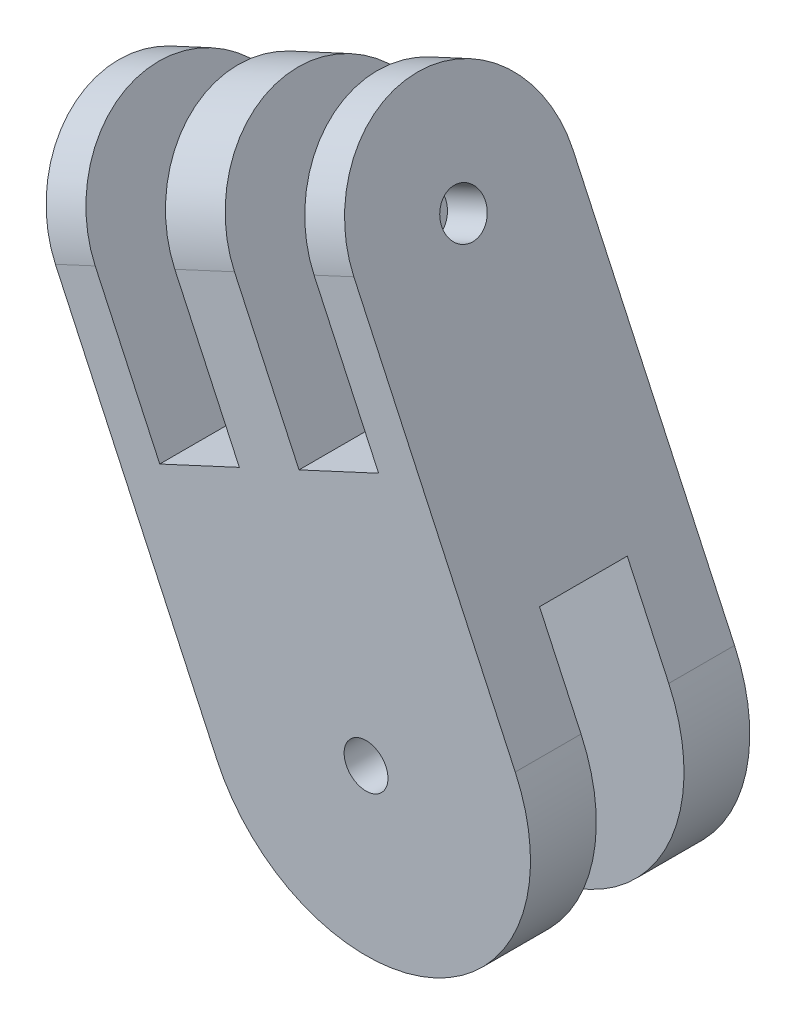
ISO-10303-21;
HEADER;
FILE_DESCRIPTION(('STEP AP214'),'2;1');
FILE_NAME('part.step','',(''),(''),'','','');
FILE_SCHEMA(('AUTOMOTIVE_DESIGN { 1 0 10303 214 1 1 1 1 }'));
ENDSEC;
DATA;
#1=APPLICATION_CONTEXT('core data for automotive mechanical design processes');
#2=APPLICATION_PROTOCOL_DEFINITION('international standard','automotive_design',2000,#1);
#3=PRODUCT_CONTEXT('',#1,'mechanical');
#4=PRODUCT('Part','Part','',(#3));
#5=PRODUCT_RELATED_PRODUCT_CATEGORY('part','',(#4));
#6=PRODUCT_DEFINITION_FORMATION('','',#4);
#7=PRODUCT_DEFINITION_CONTEXT('part definition',#1,'design');
#8=PRODUCT_DEFINITION('design','',#6,#7);
#9=PRODUCT_DEFINITION_SHAPE('','',#8);
#10=(LENGTH_UNIT() NAMED_UNIT(*) SI_UNIT(.MILLI.,.METRE.));
#11=(NAMED_UNIT(*) PLANE_ANGLE_UNIT() SI_UNIT($,.RADIAN.));
#12=(NAMED_UNIT(*) SI_UNIT($,.STERADIAN.) SOLID_ANGLE_UNIT());
#13=UNCERTAINTY_MEASURE_WITH_UNIT(LENGTH_MEASURE(1.E-05),#10,'distance_accuracy_value','');
#14=(GEOMETRIC_REPRESENTATION_CONTEXT(3) GLOBAL_UNCERTAINTY_ASSIGNED_CONTEXT((#13)) GLOBAL_UNIT_ASSIGNED_CONTEXT((#10,
#11,#12)) REPRESENTATION_CONTEXT('',''));
#15=CARTESIAN_POINT('',(0.,0.,0.));
#16=DIRECTION('',(0.,0.,1.));
#17=DIRECTION('',(1.,0.,0.));
#18=AXIS2_PLACEMENT_3D('',#15,#16,#17);
#19=CARTESIAN_POINT('',(-41.5292782261181,-19.251151013862,10.));
#20=DIRECTION('',(0.907261631256999,0.420566680145836,0.));
#21=DIRECTION('',(-0.420566680145836,0.907261631256999,0.));
#22=AXIS2_PLACEMENT_3D('',#19,#20,#21);
#23=PLANE('',#22);
#24=CARTESIAN_POINT('',(-85.2157958373442,74.9909825240462,5.));
#25=DIRECTION('',(-0.907261631256999,-0.420566680145836,0.));
#26=DIRECTION('',(0.420566680145836,-0.907261631256999,0.));
#27=AXIS2_PLACEMENT_3D('',#24,#25,#26);
#28=CIRCLE('',#27,0.999999999999999);
#29=CARTESIAN_POINT('',(-84.7952291571984,74.0837208927892,5.));
#30=VERTEX_POINT('',#29);
#31=EDGE_CURVE('E353',#30,#30,#28,.T.);
#32=ORIENTED_EDGE('',*,*,#31,.F.);
#33=EDGE_LOOP('',(#32));
#34=FACE_BOUND('',#33,.T.);
#35=DIRECTION('',(0.420566680145836,-0.907261631256999,0.));
#36=VECTOR('',#35,1.);
#37=CARTESIAN_POINT('',(-41.5292782261181,-19.251151013862,10.));
#38=LINE('',#37,#36);
#39=CARTESIAN_POINT('',(-85.2157958373442,74.9909825240462,10.));
#40=VERTEX_POINT('',#39);
#41=CARTESIAN_POINT('',(-77.8558789347921,59.1139039770487,10.));
#42=VERTEX_POINT('',#41);
#43=EDGE_CURVE('E225',#40,#42,#38,.T.);
#44=ORIENTED_EDGE('',*,*,#43,.F.);
#45=CARTESIAN_POINT('',(-85.2157958373442,74.9909825240462,5.));
#46=DIRECTION('',(-0.907261631256999,-0.420566680145836,0.));
#47=DIRECTION('',(0.420566680145836,-0.907261631256999,0.));
#48=AXIS2_PLACEMENT_3D('',#45,#46,#47);
#49=CIRCLE('',#48,5.);
#50=CARTESIAN_POINT('',(-85.2157958373442,74.9909825240462,0.));
#51=VERTEX_POINT('',#50);
#52=EDGE_CURVE('E204',#51,#40,#49,.F.);
#53=ORIENTED_EDGE('',*,*,#52,.F.);
#54=DIRECTION('',(0.420566680145836,-0.907261631256999,0.));
#55=VECTOR('',#54,1.);
#56=CARTESIAN_POINT('',(-41.5292782261181,-19.251151013862,0.));
#57=LINE('',#56,#55);
#58=CARTESIAN_POINT('',(-77.8558789347921,59.1139039770487,0.));
#59=VERTEX_POINT('',#58);
#60=EDGE_CURVE('E244',#51,#59,#57,.T.);
#61=ORIENTED_EDGE('',*,*,#60,.T.);
#62=DIRECTION('',(0.,0.,-1.));
#63=VECTOR('',#62,1.);
#64=CARTESIAN_POINT('',(-77.8558789347921,59.1139039770487,10.));
#65=LINE('',#64,#63);
#66=CARTESIAN_POINT('',(-77.8558789347921,59.1139039770487,3.));
#67=VERTEX_POINT('',#66);
#68=EDGE_CURVE('E280',#67,#59,#65,.T.);
#69=ORIENTED_EDGE('',*,*,#68,.F.);
#70=DIRECTION('',(-0.420566680145836,0.907261631256999,0.));
#71=VECTOR('',#70,1.);
#72=CARTESIAN_POINT('',(-41.5292782261182,-19.251151013862,3.));
#73=LINE('',#72,#71);
#74=CARTESIAN_POINT('',(-79.7484289954484,63.1965813177052,3.));
#75=VERTEX_POINT('',#74);
#76=EDGE_CURVE('E341',#67,#75,#73,.T.);
#77=ORIENTED_EDGE('',*,*,#76,.T.);
#78=DIRECTION('',(0.,0.,1.));
#79=VECTOR('',#78,1.);
#80=CARTESIAN_POINT('',(-79.7484289954484,63.1965813177052,0.));
#81=LINE('',#80,#79);
#82=CARTESIAN_POINT('',(-79.7484289954484,63.1965813177052,7.));
#83=VERTEX_POINT('',#82);
#84=EDGE_CURVE('E346',#75,#83,#81,.T.);
#85=ORIENTED_EDGE('',*,*,#84,.T.);
#86=DIRECTION('',(0.420566680145836,-0.907261631256999,0.));
#87=VECTOR('',#86,1.);
#88=CARTESIAN_POINT('',(-41.5292782261182,-19.251151013862,7.00000000000001));
#89=LINE('',#88,#87);
#90=CARTESIAN_POINT('',(-77.8558789347921,59.1139039770487,7.));
#91=VERTEX_POINT('',#90);
#92=EDGE_CURVE('E330',#83,#91,#89,.T.);
#93=ORIENTED_EDGE('',*,*,#92,.T.);
#94=EDGE_CURVE('E281',#42,#91,#65,.T.);
#95=ORIENTED_EDGE('',*,*,#94,.F.);
#96=EDGE_LOOP('',(#44,#53,#61,#69,#77,#85,#93,#95));
#97=FACE_BOUND('',#96,.T.);
#98=ADVANCED_FACE('F81',(#34,#97),#23,.F.);
#99=CARTESIAN_POINT('',(-27.9203537572631,-12.9426508116744,10.));
#100=DIRECTION('',(-0.907261631256998,-0.420566680145836,0.));
#101=DIRECTION('',(0.420566680145836,-0.907261631256999,0.));
#102=AXIS2_PLACEMENT_3D('',#99,#100,#101);
#103=PLANE('',#102);
#104=CARTESIAN_POINT('',(-71.6068713684893,81.2994827262337,5.));
#105=DIRECTION('',(-0.907261631256999,-0.420566680145836,0.));
#106=DIRECTION('',(0.420566680145836,-0.907261631256999,0.));
#107=AXIS2_PLACEMENT_3D('',#104,#105,#106);
#108=CIRCLE('',#107,0.999999999999999);
#109=CARTESIAN_POINT('',(-71.1863046883434,80.3922210949767,5.));
#110=VERTEX_POINT('',#109);
#111=EDGE_CURVE('E214',#110,#110,#108,.T.);
#112=ORIENTED_EDGE('',*,*,#111,.T.);
#113=EDGE_LOOP('',(#112));
#114=FACE_BOUND('',#113,.T.);
#115=CARTESIAN_POINT('',(-71.6068713684893,81.2994827262337,5.));
#116=DIRECTION('',(-0.907261631256999,-0.420566680145836,0.));
#117=DIRECTION('',(0.420566680145836,-0.907261631256999,0.));
#118=AXIS2_PLACEMENT_3D('',#115,#116,#117);
#119=CIRCLE('',#118,5.);
#120=CARTESIAN_POINT('',(-71.6068713684893,81.2994827262338,0.));
#121=VERTEX_POINT('',#120);
#122=CARTESIAN_POINT('',(-71.6068713684893,81.2994827262337,10.));
#123=VERTEX_POINT('',#122);
#124=EDGE_CURVE('E98',#121,#123,#119,.F.);
#125=ORIENTED_EDGE('',*,*,#124,.T.);
#126=DIRECTION('',(-0.420566680145836,0.907261631256999,0.));
#127=VECTOR('',#126,1.);
#128=CARTESIAN_POINT('',(-27.9203537572631,-12.9426508116744,10.));
#129=LINE('',#128,#127);
#130=CARTESIAN_POINT('',(-64.2469544659371,65.4224041792363,10.));
#131=VERTEX_POINT('',#130);
#132=EDGE_CURVE('E199',#131,#123,#129,.T.);
#133=ORIENTED_EDGE('',*,*,#132,.F.);
#134=DIRECTION('',(0.,0.,-1.));
#135=VECTOR('',#134,1.);
#136=CARTESIAN_POINT('',(-64.2469544659371,65.4224041792363,10.));
#137=LINE('',#136,#135);
#138=CARTESIAN_POINT('',(-64.2469544659372,65.4224041792363,7.));
#139=VERTEX_POINT('',#138);
#140=EDGE_CURVE('E278',#131,#139,#137,.T.);
#141=ORIENTED_EDGE('',*,*,#140,.T.);
#142=DIRECTION('',(0.420566680145836,-0.907261631256999,0.));
#143=VECTOR('',#142,1.);
#144=CARTESIAN_POINT('',(-27.9203537572632,-12.9426508116745,7.00000000000001));
#145=LINE('',#144,#143);
#146=CARTESIAN_POINT('',(-66.1395045265934,69.5050815198928,7.));
#147=VERTEX_POINT('',#146);
#148=EDGE_CURVE('E336',#147,#139,#145,.T.);
#149=ORIENTED_EDGE('',*,*,#148,.F.);
#150=DIRECTION('',(0.,0.,1.));
#151=VECTOR('',#150,1.);
#152=CARTESIAN_POINT('',(-66.1395045265934,69.5050815198928,0.));
#153=LINE('',#152,#151);
#154=CARTESIAN_POINT('',(-66.1395045265934,69.5050815198928,3.));
#155=VERTEX_POINT('',#154);
#156=EDGE_CURVE('E338',#155,#147,#153,.T.);
#157=ORIENTED_EDGE('',*,*,#156,.F.);
#158=DIRECTION('',(-0.420566680145836,0.907261631256999,0.));
#159=VECTOR('',#158,1.);
#160=CARTESIAN_POINT('',(-27.9203537572632,-12.9426508116745,3.));
#161=LINE('',#160,#159);
#162=CARTESIAN_POINT('',(-64.2469544659372,65.4224041792363,3.));
#163=VERTEX_POINT('',#162);
#164=EDGE_CURVE('E343',#163,#155,#161,.T.);
#165=ORIENTED_EDGE('',*,*,#164,.F.);
#166=CARTESIAN_POINT('',(-64.2469544659371,65.4224041792363,0.));
#167=VERTEX_POINT('',#166);
#168=EDGE_CURVE('E277',#163,#167,#137,.T.);
#169=ORIENTED_EDGE('',*,*,#168,.T.);
#170=DIRECTION('',(-0.420566680145836,0.907261631256999,0.));
#171=VECTOR('',#170,1.);
#172=CARTESIAN_POINT('',(-27.9203537572631,-12.9426508116744,0.));
#173=LINE('',#172,#171);
#174=EDGE_CURVE('E202',#167,#121,#173,.T.);
#175=ORIENTED_EDGE('',*,*,#174,.T.);
#176=EDGE_LOOP('',(#125,#133,#141,#149,#157,#165,#169,#175));
#177=FACE_BOUND('',#176,.T.);
#178=ADVANCED_FACE('F196',(#114,#177),#103,.F.);
#179=CARTESIAN_POINT('',(-29.7348770197771,-13.7837841719661,10.));
#180=DIRECTION('',(0.907261631256999,0.420566680145836,0.));
#181=DIRECTION('',(-0.420566680145836,0.907261631256999,0.));
#182=AXIS2_PLACEMENT_3D('',#179,#180,#181);
#183=PLANE('',#182);
#184=DIRECTION('',(0.420566680145836,-0.907261631256999,0.));
#185=VECTOR('',#184,1.);
#186=CARTESIAN_POINT('',(-29.7348770197771,-13.7837841719661,10.));
#187=LINE('',#186,#185);
#188=CARTESIAN_POINT('',(-73.4213946310032,80.4583493659421,10.));
#189=VERTEX_POINT('',#188);
#190=CARTESIAN_POINT('',(-70.4774278699824,74.1075179471431,10.));
#191=VERTEX_POINT('',#190);
#192=EDGE_CURVE('E221',#189,#191,#187,.T.);
#193=ORIENTED_EDGE('',*,*,#192,.F.);
#194=CARTESIAN_POINT('',(-73.4213946310032,80.4583493659421,5.));
#195=DIRECTION('',(0.907261631256999,0.420566680145836,0.));
#196=DIRECTION('',(-0.420566680145836,0.907261631256999,0.));
#197=AXIS2_PLACEMENT_3D('',#194,#195,#196);
#198=CIRCLE('',#197,5.);
#199=CARTESIAN_POINT('',(-73.4213946310032,80.4583493659421,0.));
#200=VERTEX_POINT('',#199);
#201=EDGE_CURVE('E210',#189,#200,#198,.F.);
#202=ORIENTED_EDGE('',*,*,#201,.T.);
#203=DIRECTION('',(0.420566680145836,-0.907261631256999,0.));
#204=VECTOR('',#203,1.);
#205=CARTESIAN_POINT('',(-29.7348770197771,-13.7837841719661,0.));
#206=LINE('',#205,#204);
#207=CARTESIAN_POINT('',(-70.4774278699824,74.1075179471431,0.));
#208=VERTEX_POINT('',#207);
#209=EDGE_CURVE('E251',#200,#208,#206,.T.);
#210=ORIENTED_EDGE('',*,*,#209,.T.);
#211=DIRECTION('',(0.,0.,-1.));
#212=VECTOR('',#211,1.);
#213=CARTESIAN_POINT('',(-70.4774278699824,74.1075179471431,10.));
#214=LINE('',#213,#212);
#215=EDGE_CURVE('E274',#191,#208,#214,.T.);
#216=ORIENTED_EDGE('',*,*,#215,.F.);
#217=EDGE_LOOP('',(#193,#202,#210,#216));
#218=FACE_BOUND('',#217,.T.);
#219=CARTESIAN_POINT('',(-73.4213946310032,80.4583493659421,5.));
#220=DIRECTION('',(0.907261631256999,0.420566680145836,0.));
#221=DIRECTION('',(-0.420566680145836,0.907261631256999,0.));
#222=AXIS2_PLACEMENT_3D('',#219,#220,#221);
#223=CIRCLE('',#222,0.999999999999999);
#224=CARTESIAN_POINT('',(-73.8419613111491,81.3656109971991,5.));
#225=VERTEX_POINT('',#224);
#226=EDGE_CURVE('E310',#225,#225,#223,.T.);
#227=ORIENTED_EDGE('',*,*,#226,.T.);
#228=EDGE_LOOP('',(#227));
#229=FACE_BOUND('',#228,.T.);
#230=ADVANCED_FACE('F371',(#218,#229),#183,.F.);
#231=CARTESIAN_POINT('',(-33.3639235448052,-15.4660508925495,10.));
#232=DIRECTION('',(-0.907261631256999,-0.420566680145835,0.));
#233=DIRECTION('',(0.420566680145835,-0.907261631256999,0.));
#234=AXIS2_PLACEMENT_3D('',#231,#232,#233);
#235=PLANE('',#234);
#236=CARTESIAN_POINT('',(-77.0504411560312,78.7760826453587,5.));
#237=DIRECTION('',(-0.907261631256999,-0.420566680145835,0.));
#238=DIRECTION('',(0.420566680145835,-0.907261631256999,0.));
#239=AXIS2_PLACEMENT_3D('',#236,#237,#238);
#240=CIRCLE('',#239,5.);
#241=CARTESIAN_POINT('',(-77.0504411560312,78.7760826453587,0.));
#242=VERTEX_POINT('',#241);
#243=CARTESIAN_POINT('',(-77.0504411560312,78.7760826453587,10.));
#244=VERTEX_POINT('',#243);
#245=EDGE_CURVE('E106',#242,#244,#240,.F.);
#246=ORIENTED_EDGE('',*,*,#245,.T.);
#247=DIRECTION('',(-0.420566680145835,0.907261631256999,0.));
#248=VECTOR('',#247,1.);
#249=CARTESIAN_POINT('',(-33.3639235448052,-15.4660508925495,10.));
#250=LINE('',#249,#248);
#251=CARTESIAN_POINT('',(-74.1064743950104,72.4252512265597,10.));
#252=VERTEX_POINT('',#251);
#253=EDGE_CURVE('E230',#252,#244,#250,.T.);
#254=ORIENTED_EDGE('',*,*,#253,.F.);
#255=DIRECTION('',(0.,0.,-1.));
#256=VECTOR('',#255,1.);
#257=CARTESIAN_POINT('',(-74.1064743950104,72.4252512265597,10.));
#258=LINE('',#257,#256);
#259=CARTESIAN_POINT('',(-74.1064743950104,72.4252512265597,0.));
#260=VERTEX_POINT('',#259);
#261=EDGE_CURVE('E271',#252,#260,#258,.T.);
#262=ORIENTED_EDGE('',*,*,#261,.T.);
#263=DIRECTION('',(-0.420566680145835,0.907261631256999,0.));
#264=VECTOR('',#263,1.);
#265=CARTESIAN_POINT('',(-33.3639235448052,-15.4660508925495,0.));
#266=LINE('',#265,#264);
#267=EDGE_CURVE('E255',#260,#242,#266,.T.);
#268=ORIENTED_EDGE('',*,*,#267,.T.);
#269=EDGE_LOOP('',(#246,#254,#262,#268));
#270=FACE_BOUND('',#269,.T.);
#271=CARTESIAN_POINT('',(-77.0504411560312,78.7760826453587,5.));
#272=DIRECTION('',(-0.907261631256999,-0.420566680145835,0.));
#273=DIRECTION('',(0.420566680145835,-0.907261631256999,0.));
#274=AXIS2_PLACEMENT_3D('',#271,#272,#273);
#275=CIRCLE('',#274,0.999999999999999);
#276=CARTESIAN_POINT('',(-76.6298744758854,77.8688210141017,5.));
#277=VERTEX_POINT('',#276);
#278=EDGE_CURVE('E307',#277,#277,#275,.T.);
#279=ORIENTED_EDGE('',*,*,#278,.T.);
#280=EDGE_LOOP('',(#279));
#281=FACE_BOUND('',#280,.T.);
#282=ADVANCED_FACE('F382',(#270,#281),#235,.F.);
#283=CARTESIAN_POINT('',(-36.085708438576,-16.727750932987,10.));
#284=DIRECTION('',(0.907261631256998,0.420566680145837,0.));
#285=DIRECTION('',(-0.420566680145837,0.907261631256998,0.));
#286=AXIS2_PLACEMENT_3D('',#283,#284,#285);
#287=PLANE('',#286);
#288=DIRECTION('',(0.420566680145837,-0.907261631256998,0.));
#289=VECTOR('',#288,1.);
#290=CARTESIAN_POINT('',(-36.085708438576,-16.727750932987,10.));
#291=LINE('',#290,#289);
#292=CARTESIAN_POINT('',(-79.7722260498022,77.5143826049212,10.));
#293=VERTEX_POINT('',#292);
#294=CARTESIAN_POINT('',(-76.8282592887814,71.1635511861222,10.));
#295=VERTEX_POINT('',#294);
#296=EDGE_CURVE('E233',#293,#295,#291,.T.);
#297=ORIENTED_EDGE('',*,*,#296,.F.);
#298=CARTESIAN_POINT('',(-79.7722260498022,77.5143826049212,5.));
#299=DIRECTION('',(0.907261631256998,0.420566680145837,0.));
#300=DIRECTION('',(-0.420566680145837,0.907261631256998,0.));
#301=AXIS2_PLACEMENT_3D('',#298,#299,#300);
#302=CIRCLE('',#301,5.);
#303=CARTESIAN_POINT('',(-79.7722260498022,77.5143826049212,0.));
#304=VERTEX_POINT('',#303);
#305=EDGE_CURVE('E317',#293,#304,#302,.F.);
#306=ORIENTED_EDGE('',*,*,#305,.T.);
#307=DIRECTION('',(0.420566680145837,-0.907261631256998,0.));
#308=VECTOR('',#307,1.);
#309=CARTESIAN_POINT('',(-36.085708438576,-16.727750932987,0.));
#310=LINE('',#309,#308);
#311=CARTESIAN_POINT('',(-76.8282592887814,71.1635511861222,0.));
#312=VERTEX_POINT('',#311);
#313=EDGE_CURVE('E258',#304,#312,#310,.T.);
#314=ORIENTED_EDGE('',*,*,#313,.T.);
#315=DIRECTION('',(0.,0.,-1.));
#316=VECTOR('',#315,1.);
#317=CARTESIAN_POINT('',(-76.8282592887814,71.1635511861222,10.));
#318=LINE('',#317,#316);
#319=EDGE_CURVE('E268',#295,#312,#318,.T.);
#320=ORIENTED_EDGE('',*,*,#319,.F.);
#321=EDGE_LOOP('',(#297,#306,#314,#320));
#322=FACE_BOUND('',#321,.T.);
#323=CARTESIAN_POINT('',(-79.7722260498022,77.5143826049212,5.));
#324=DIRECTION('',(0.907261631256998,0.420566680145837,0.));
#325=DIRECTION('',(-0.420566680145837,0.907261631256998,0.));
#326=AXIS2_PLACEMENT_3D('',#323,#324,#325);
#327=CIRCLE('',#326,0.999999999999999);
#328=CARTESIAN_POINT('',(-80.1927927299481,78.4216442361782,5.));
#329=VERTEX_POINT('',#328);
#330=EDGE_CURVE('E304',#329,#329,#327,.T.);
#331=ORIENTED_EDGE('',*,*,#330,.T.);
#332=EDGE_LOOP('',(#331));
#333=FACE_BOUND('',#332,.T.);
#334=ADVANCED_FACE('F388',(#322,#333),#287,.F.);
#335=CARTESIAN_POINT('',(-39.7147549636041,-18.4100176535703,10.));
#336=DIRECTION('',(-0.907261631256999,-0.420566680145836,0.));
#337=DIRECTION('',(0.420566680145836,-0.907261631256999,0.));
#338=AXIS2_PLACEMENT_3D('',#335,#336,#337);
#339=PLANE('',#338);
#340=CARTESIAN_POINT('',(-83.4012725748302,75.8321158843379,5.));
#341=DIRECTION('',(-0.907261631256999,-0.420566680145836,0.));
#342=DIRECTION('',(0.420566680145836,-0.907261631256999,0.));
#343=AXIS2_PLACEMENT_3D('',#340,#341,#342);
#344=CIRCLE('',#343,5.);
#345=CARTESIAN_POINT('',(-83.4012725748302,75.8321158843379,0.));
#346=VERTEX_POINT('',#345);
#347=CARTESIAN_POINT('',(-83.4012725748302,75.8321158843379,10.));
#348=VERTEX_POINT('',#347);
#349=EDGE_CURVE('E315',#346,#348,#344,.F.);
#350=ORIENTED_EDGE('',*,*,#349,.T.);
#351=DIRECTION('',(-0.420566680145836,0.907261631256999,0.));
#352=VECTOR('',#351,1.);
#353=CARTESIAN_POINT('',(-39.7147549636041,-18.4100176535703,10.));
#354=LINE('',#353,#352);
#355=CARTESIAN_POINT('',(-80.4573058138094,69.4812844655389,10.));
#356=VERTEX_POINT('',#355);
#357=EDGE_CURVE('E237',#356,#348,#354,.T.);
#358=ORIENTED_EDGE('',*,*,#357,.F.);
#359=DIRECTION('',(0.,0.,-1.));
#360=VECTOR('',#359,1.);
#361=CARTESIAN_POINT('',(-80.4573058138094,69.4812844655389,10.));
#362=LINE('',#361,#360);
#363=CARTESIAN_POINT('',(-80.4573058138094,69.4812844655389,0.));
#364=VERTEX_POINT('',#363);
#365=EDGE_CURVE('E240',#356,#364,#362,.T.);
#366=ORIENTED_EDGE('',*,*,#365,.T.);
#367=DIRECTION('',(-0.420566680145836,0.907261631256999,0.));
#368=VECTOR('',#367,1.);
#369=CARTESIAN_POINT('',(-39.7147549636041,-18.4100176535703,0.));
#370=LINE('',#369,#368);
#371=EDGE_CURVE('E262',#364,#346,#370,.T.);
#372=ORIENTED_EDGE('',*,*,#371,.T.);
#373=EDGE_LOOP('',(#350,#358,#366,#372));
#374=FACE_BOUND('',#373,.T.);
#375=CARTESIAN_POINT('',(-83.4012725748302,75.8321158843379,5.));
#376=DIRECTION('',(-0.907261631256999,-0.420566680145836,0.));
#377=DIRECTION('',(0.420566680145836,-0.907261631256999,0.));
#378=AXIS2_PLACEMENT_3D('',#375,#376,#377);
#379=CIRCLE('',#378,0.999999999999999);
#380=CARTESIAN_POINT('',(-82.9807058946844,74.9248542530809,5.));
#381=VERTEX_POINT('',#380);
#382=EDGE_CURVE('E85',#381,#381,#379,.T.);
#383=ORIENTED_EDGE('',*,*,#382,.T.);
#384=EDGE_LOOP('',(#383));
#385=FACE_BOUND('',#384,.T.);
#386=ADVANCED_FACE('F398',(#374,#385),#339,.F.);
#387=CARTESIAN_POINT('',(-71.0514167003646,62.2681540781425,10.));
#388=DIRECTION('',(0.,0.,-1.));
#389=DIRECTION('',(-1.,0.,0.));
#390=AXIS2_PLACEMENT_3D('',#387,#388,#389);
#391=CYLINDRICAL_SURFACE('',#390,7.49999999999998);
#392=ORIENTED_EDGE('',*,*,#94,.T.);
#393=CARTESIAN_POINT('',(-71.0514167003646,62.2681540781425,7.));
#394=DIRECTION('',(0.,0.,-1.));
#395=DIRECTION('',(0.,1.,0.));
#396=AXIS2_PLACEMENT_3D('',#393,#394,#395);
#397=CIRCLE('',#396,7.49999999999998);
#398=EDGE_CURVE('E292',#91,#139,#397,.F.);
#399=ORIENTED_EDGE('',*,*,#398,.T.);
#400=ORIENTED_EDGE('',*,*,#140,.F.);
#401=CARTESIAN_POINT('',(-71.0514167003646,62.2681540781425,10.));
#402=DIRECTION('',(0.,0.,1.));
#403=DIRECTION('',(1.,0.,0.));
#404=AXIS2_PLACEMENT_3D('',#401,#402,#403);
#405=CIRCLE('',#404,7.49999999999998);
#406=EDGE_CURVE('E220',#131,#42,#405,.F.);
#407=ORIENTED_EDGE('',*,*,#406,.T.);
#408=EDGE_LOOP('',(#392,#399,#400,#407));
#409=FACE_BOUND('',#408,.T.);
#410=ADVANCED_FACE('F332',(#409),#391,.T.);
#411=CARTESIAN_POINT('',(-71.0514167003646,62.2681540781425,3.));
#412=DIRECTION('',(0.,0.,1.));
#413=DIRECTION('',(1.,0.,0.));
#414=AXIS2_PLACEMENT_3D('',#411,#412,#413);
#415=CIRCLE('',#414,7.49999999999998);
#416=EDGE_CURVE('E289',#163,#67,#415,.F.);
#417=ORIENTED_EDGE('',*,*,#416,.T.);
#418=ORIENTED_EDGE('',*,*,#68,.T.);
#419=CARTESIAN_POINT('',(-71.0514167003646,62.2681540781425,0.));
#420=DIRECTION('',(0.,0.,1.));
#421=DIRECTION('',(1.,0.,0.));
#422=AXIS2_PLACEMENT_3D('',#419,#420,#421);
#423=CIRCLE('',#422,7.49999999999998);
#424=EDGE_CURVE('E247',#167,#59,#423,.F.);
#425=ORIENTED_EDGE('',*,*,#424,.F.);
#426=ORIENTED_EDGE('',*,*,#168,.F.);
#427=EDGE_LOOP('',(#417,#418,#425,#426));
#428=FACE_BOUND('',#427,.T.);
#429=ADVANCED_FACE('F364',(#428),#391,.T.);
#430=CARTESIAN_POINT('',(-71.0514167003646,62.2681540781425,10.));
#431=DIRECTION('',(0.,0.,-1.));
#432=DIRECTION('',(-1.,0.,0.));
#433=AXIS2_PLACEMENT_3D('',#430,#431,#432);
#434=CYLINDRICAL_SURFACE('',#433,0.999999999999998);
#435=CARTESIAN_POINT('',(-71.0514167003646,62.2681540781425,10.));
#436=DIRECTION('',(0.,0.,1.));
#437=DIRECTION('',(1.,0.,0.));
#438=AXIS2_PLACEMENT_3D('',#435,#436,#437);
#439=CIRCLE('',#438,0.999999999999998);
#440=CARTESIAN_POINT('',(-70.0514167003646,62.2681540781425,10.));
#441=VERTEX_POINT('',#440);
#442=EDGE_CURVE('E265',#441,#441,#439,.T.);
#443=ORIENTED_EDGE('',*,*,#442,.T.);
#444=EDGE_LOOP('',(#443));
#445=FACE_BOUND('',#444,.T.);
#446=CARTESIAN_POINT('',(-71.0514167003646,62.2681540781425,7.));
#447=DIRECTION('',(0.,0.,-1.));
#448=DIRECTION('',(0.,1.,0.));
#449=AXIS2_PLACEMENT_3D('',#446,#447,#448);
#450=CIRCLE('',#449,0.999999999999998);
#451=CARTESIAN_POINT('',(-71.0514167003646,63.2681540781425,7.));
#452=VERTEX_POINT('',#451);
#453=EDGE_CURVE('E290',#452,#452,#450,.T.);
#454=ORIENTED_EDGE('',*,*,#453,.T.);
#455=EDGE_LOOP('',(#454));
#456=FACE_BOUND('',#455,.T.);
#457=ADVANCED_FACE('F83',(#445,#456),#434,.F.);
#458=CARTESIAN_POINT('',(-71.0514167003646,62.2681540781425,0.));
#459=DIRECTION('',(0.,0.,1.));
#460=DIRECTION('',(1.,0.,0.));
#461=AXIS2_PLACEMENT_3D('',#458,#459,#460);
#462=CIRCLE('',#461,0.999999999999998);
#463=CARTESIAN_POINT('',(-70.0514167003646,62.2681540781425,0.));
#464=VERTEX_POINT('',#463);
#465=EDGE_CURVE('E241',#464,#464,#462,.T.);
#466=ORIENTED_EDGE('',*,*,#465,.F.);
#467=EDGE_LOOP('',(#466));
#468=FACE_BOUND('',#467,.T.);
#469=CARTESIAN_POINT('',(-71.0514167003646,62.2681540781425,3.));
#470=DIRECTION('',(0.,0.,1.));
#471=DIRECTION('',(1.,0.,0.));
#472=AXIS2_PLACEMENT_3D('',#469,#470,#471);
#473=CIRCLE('',#472,0.999999999999998);
#474=CARTESIAN_POINT('',(-70.0514167003646,62.2681540781425,3.));
#475=VERTEX_POINT('',#474);
#476=EDGE_CURVE('E213',#475,#475,#473,.T.);
#477=ORIENTED_EDGE('',*,*,#476,.T.);
#478=EDGE_LOOP('',(#477));
#479=FACE_BOUND('',#478,.T.);
#480=ADVANCED_FACE('F428',(#468,#479),#434,.F.);
#481=CARTESIAN_POINT('',(-40.7425508502053,87.8913021191092,10.));
#482=DIRECTION('',(0.420566680145837,-0.907261631256998,0.));
#483=DIRECTION('',(0.907261631256998,0.420566680145837,0.));
#484=AXIS2_PLACEMENT_3D('',#481,#482,#483);
#485=PLANE('',#484);
#486=DIRECTION('',(-0.907261631256998,-0.420566680145837,0.));
#487=VECTOR('',#486,1.);
#488=CARTESIAN_POINT('',(-40.7425508502053,87.8913021191092,0.));
#489=LINE('',#488,#487);
#490=EDGE_CURVE('E253',#208,#260,#489,.T.);
#491=ORIENTED_EDGE('',*,*,#490,.T.);
#492=ORIENTED_EDGE('',*,*,#261,.F.);
#493=DIRECTION('',(-0.907261631256998,-0.420566680145837,0.));
#494=VECTOR('',#493,1.);
#495=CARTESIAN_POINT('',(-40.7425508502053,87.8913021191092,10.));
#496=LINE('',#495,#494);
#497=EDGE_CURVE('E223',#191,#252,#496,.T.);
#498=ORIENTED_EDGE('',*,*,#497,.F.);
#499=ORIENTED_EDGE('',*,*,#215,.T.);
#500=EDGE_LOOP('',(#491,#492,#498,#499));
#501=FACE_BOUND('',#500,.T.);
#502=ADVANCED_FACE('F379',(#501),#485,.F.);
#503=CARTESIAN_POINT('',(-40.7425508502051,87.8913021191092,10.));
#504=DIRECTION('',(0.420566680145835,-0.907261631256999,0.));
#505=DIRECTION('',(0.907261631256999,0.420566680145835,0.));
#506=AXIS2_PLACEMENT_3D('',#503,#504,#505);
#507=PLANE('',#506);
#508=DIRECTION('',(-0.907261631256999,-0.420566680145835,0.));
#509=VECTOR('',#508,1.);
#510=CARTESIAN_POINT('',(-40.7425508502051,87.8913021191092,0.));
#511=LINE('',#510,#509);
#512=EDGE_CURVE('E260',#312,#364,#511,.T.);
#513=ORIENTED_EDGE('',*,*,#512,.T.);
#514=ORIENTED_EDGE('',*,*,#365,.F.);
#515=DIRECTION('',(-0.907261631256999,-0.420566680145835,0.));
#516=VECTOR('',#515,1.);
#517=CARTESIAN_POINT('',(-40.7425508502051,87.8913021191092,10.));
#518=LINE('',#517,#516);
#519=EDGE_CURVE('E235',#295,#356,#518,.T.);
#520=ORIENTED_EDGE('',*,*,#519,.F.);
#521=ORIENTED_EDGE('',*,*,#319,.T.);
#522=EDGE_LOOP('',(#513,#514,#520,#521));
#523=FACE_BOUND('',#522,.T.);
#524=ADVANCED_FACE('F395',(#523),#507,.F.);
#525=CARTESIAN_POINT('',(0.,0.,10.));
#526=DIRECTION('',(0.,0.,1.));
#527=DIRECTION('',(1.,0.,0.));
#528=AXIS2_PLACEMENT_3D('',#525,#526,#527);
#529=PLANE('',#528);
#530=DIRECTION('',(-0.907261631256999,-0.420566680145836,0.));
#531=VECTOR('',#530,1.);
#532=CARTESIAN_POINT('',(-71.6068713684893,81.2994827262337,10.));
#533=LINE('',#532,#531);
#534=EDGE_CURVE('E12',#40,#348,#533,.F.);
#535=ORIENTED_EDGE('',*,*,#534,.F.);
#536=ORIENTED_EDGE('',*,*,#43,.T.);
#537=ORIENTED_EDGE('',*,*,#406,.F.);
#538=ORIENTED_EDGE('',*,*,#132,.T.);
#539=DIRECTION('',(-0.907261631256999,-0.420566680145836,0.));
#540=VECTOR('',#539,1.);
#541=CARTESIAN_POINT('',(-71.6068713684893,81.2994827262337,10.));
#542=LINE('',#541,#540);
#543=EDGE_CURVE('E207',#123,#189,#542,.T.);
#544=ORIENTED_EDGE('',*,*,#543,.T.);
#545=ORIENTED_EDGE('',*,*,#192,.T.);
#546=ORIENTED_EDGE('',*,*,#497,.T.);
#547=ORIENTED_EDGE('',*,*,#253,.T.);
#548=EDGE_CURVE('E90',#293,#244,#533,.F.);
#549=ORIENTED_EDGE('',*,*,#548,.F.);
#550=ORIENTED_EDGE('',*,*,#296,.T.);
#551=ORIENTED_EDGE('',*,*,#519,.T.);
#552=ORIENTED_EDGE('',*,*,#357,.T.);
#553=EDGE_LOOP('',(#535,#536,#537,#538,#544,#545,#546,#547,#549,#550,#551,#552));
#554=FACE_BOUND('',#553,.T.);
#555=ORIENTED_EDGE('',*,*,#442,.F.);
#556=EDGE_LOOP('',(#555));
#557=FACE_BOUND('',#556,.T.);
#558=ADVANCED_FACE('F217',(#554,#557),#529,.T.);
#559=CARTESIAN_POINT('',(0.,0.,0.));
#560=DIRECTION('',(0.,0.,1.));
#561=DIRECTION('',(1.,0.,0.));
#562=AXIS2_PLACEMENT_3D('',#559,#560,#561);
#563=PLANE('',#562);
#564=ORIENTED_EDGE('',*,*,#465,.T.);
#565=EDGE_LOOP('',(#564));
#566=FACE_BOUND('',#565,.T.);
#567=ORIENTED_EDGE('',*,*,#60,.F.);
#568=DIRECTION('',(-0.907261631256999,-0.420566680145836,0.));
#569=VECTOR('',#568,1.);
#570=CARTESIAN_POINT('',(-71.6068713684893,81.2994827262337,0.));
#571=LINE('',#570,#569);
#572=EDGE_CURVE('E285',#51,#346,#571,.F.);
#573=ORIENTED_EDGE('',*,*,#572,.T.);
#574=ORIENTED_EDGE('',*,*,#371,.F.);
#575=ORIENTED_EDGE('',*,*,#512,.F.);
#576=ORIENTED_EDGE('',*,*,#313,.F.);
#577=EDGE_CURVE('E284',#304,#242,#571,.F.);
#578=ORIENTED_EDGE('',*,*,#577,.T.);
#579=ORIENTED_EDGE('',*,*,#267,.F.);
#580=ORIENTED_EDGE('',*,*,#490,.F.);
#581=ORIENTED_EDGE('',*,*,#209,.F.);
#582=DIRECTION('',(-0.907261631256999,-0.420566680145836,0.));
#583=VECTOR('',#582,1.);
#584=CARTESIAN_POINT('',(-71.6068713684893,81.2994827262337,0.));
#585=LINE('',#584,#583);
#586=EDGE_CURVE('E203',#121,#200,#585,.T.);
#587=ORIENTED_EDGE('',*,*,#586,.F.);
#588=ORIENTED_EDGE('',*,*,#174,.F.);
#589=ORIENTED_EDGE('',*,*,#424,.T.);
#590=EDGE_LOOP('',(#567,#573,#574,#575,#576,#578,#579,#580,#581,#587,#588,#589));
#591=FACE_BOUND('',#590,.T.);
#592=ADVANCED_FACE('F367',(#566,#591),#563,.F.);
#593=CARTESIAN_POINT('',(-71.6068713684893,81.2994827262337,5.));
#594=DIRECTION('',(-0.907261631256999,-0.420566680145836,0.));
#595=DIRECTION('',(0.420566680145836,-0.907261631256999,0.));
#596=AXIS2_PLACEMENT_3D('',#593,#594,#595);
#597=CYLINDRICAL_SURFACE('',#596,5.);
#598=ORIENTED_EDGE('',*,*,#201,.F.);
#599=ORIENTED_EDGE('',*,*,#543,.F.);
#600=ORIENTED_EDGE('',*,*,#124,.F.);
#601=ORIENTED_EDGE('',*,*,#586,.T.);
#602=EDGE_LOOP('',(#598,#599,#600,#601));
#603=FACE_BOUND('',#602,.T.);
#604=ADVANCED_FACE('F208',(#603),#597,.T.);
#605=ORIENTED_EDGE('',*,*,#577,.F.);
#606=ORIENTED_EDGE('',*,*,#305,.F.);
#607=ORIENTED_EDGE('',*,*,#548,.T.);
#608=ORIENTED_EDGE('',*,*,#245,.F.);
#609=EDGE_LOOP('',(#605,#606,#607,#608));
#610=FACE_BOUND('',#609,.T.);
#611=ADVANCED_FACE('F384',(#610),#597,.T.);
#612=ORIENTED_EDGE('',*,*,#572,.F.);
#613=ORIENTED_EDGE('',*,*,#52,.T.);
#614=ORIENTED_EDGE('',*,*,#534,.T.);
#615=ORIENTED_EDGE('',*,*,#349,.F.);
#616=EDGE_LOOP('',(#612,#613,#614,#615));
#617=FACE_BOUND('',#616,.T.);
#618=ADVANCED_FACE('F402',(#617),#597,.T.);
#619=CARTESIAN_POINT('',(-27.9203537572632,-12.9426508116745,7.00000000000001));
#620=DIRECTION('',(0.,0.,-1.));
#621=DIRECTION('',(0.,1.,0.));
#622=AXIS2_PLACEMENT_3D('',#619,#620,#621);
#623=PLANE('',#622);
#624=ORIENTED_EDGE('',*,*,#453,.F.);
#625=EDGE_LOOP('',(#624));
#626=FACE_BOUND('',#625,.T.);
#627=ORIENTED_EDGE('',*,*,#92,.F.);
#628=DIRECTION('',(-0.907261631256999,-0.420566680145836,0.));
#629=VECTOR('',#628,1.);
#630=CARTESIAN_POINT('',(-66.1395045265934,69.5050815198928,7.));
#631=LINE('',#630,#629);
#632=EDGE_CURVE('E301',#147,#83,#631,.T.);
#633=ORIENTED_EDGE('',*,*,#632,.F.);
#634=ORIENTED_EDGE('',*,*,#148,.T.);
#635=ORIENTED_EDGE('',*,*,#398,.F.);
#636=EDGE_LOOP('',(#627,#633,#634,#635));
#637=FACE_BOUND('',#636,.T.);
#638=ADVANCED_FACE('F360',(#626,#637),#623,.T.);
#639=CARTESIAN_POINT('',(-27.9203537572632,-12.9426508116745,3.));
#640=DIRECTION('',(0.,0.,1.));
#641=DIRECTION('',(1.,0.,0.));
#642=AXIS2_PLACEMENT_3D('',#639,#640,#641);
#643=PLANE('',#642);
#644=ORIENTED_EDGE('',*,*,#476,.F.);
#645=EDGE_LOOP('',(#644));
#646=FACE_BOUND('',#645,.T.);
#647=ORIENTED_EDGE('',*,*,#416,.F.);
#648=ORIENTED_EDGE('',*,*,#164,.T.);
#649=DIRECTION('',(-0.907261631256999,-0.420566680145836,0.));
#650=VECTOR('',#649,1.);
#651=CARTESIAN_POINT('',(-66.1395045265934,69.5050815198928,3.));
#652=LINE('',#651,#650);
#653=EDGE_CURVE('E352',#155,#75,#652,.T.);
#654=ORIENTED_EDGE('',*,*,#653,.T.);
#655=ORIENTED_EDGE('',*,*,#76,.F.);
#656=EDGE_LOOP('',(#647,#648,#654,#655));
#657=FACE_BOUND('',#656,.T.);
#658=ADVANCED_FACE('F362',(#646,#657),#643,.T.);
#659=CARTESIAN_POINT('',(-66.1395045265934,69.5050815198928,0.));
#660=DIRECTION('',(0.420566680145836,-0.907261631256999,0.));
#661=DIRECTION('',(0.907261631256999,0.420566680145836,0.));
#662=AXIS2_PLACEMENT_3D('',#659,#660,#661);
#663=PLANE('',#662);
#664=ORIENTED_EDGE('',*,*,#84,.F.);
#665=ORIENTED_EDGE('',*,*,#653,.F.);
#666=ORIENTED_EDGE('',*,*,#156,.T.);
#667=ORIENTED_EDGE('',*,*,#632,.T.);
#668=EDGE_LOOP('',(#664,#665,#666,#667));
#669=FACE_BOUND('',#668,.T.);
#670=ADVANCED_FACE('F359',(#669),#663,.T.);
#671=CARTESIAN_POINT('',(-71.6068713684893,81.2994827262337,5.));
#672=DIRECTION('',(-0.907261631256999,-0.420566680145836,0.));
#673=DIRECTION('',(0.420566680145836,-0.907261631256999,0.));
#674=AXIS2_PLACEMENT_3D('',#671,#672,#673);
#675=CYLINDRICAL_SURFACE('',#674,0.999999999999999);
#676=ORIENTED_EDGE('',*,*,#31,.T.);
#677=EDGE_LOOP('',(#676));
#678=FACE_BOUND('',#677,.T.);
#679=ORIENTED_EDGE('',*,*,#382,.F.);
#680=EDGE_LOOP('',(#679));
#681=FACE_BOUND('',#680,.T.);
#682=ADVANCED_FACE('F489',(#678,#681),#675,.F.);
#683=ORIENTED_EDGE('',*,*,#330,.F.);
#684=EDGE_LOOP('',(#683));
#685=FACE_BOUND('',#684,.T.);
#686=ORIENTED_EDGE('',*,*,#278,.F.);
#687=EDGE_LOOP('',(#686));
#688=FACE_BOUND('',#687,.T.);
#689=ADVANCED_FACE('F499',(#685,#688),#675,.F.);
#690=ORIENTED_EDGE('',*,*,#111,.F.);
#691=EDGE_LOOP('',(#690));
#692=FACE_BOUND('',#691,.T.);
#693=ORIENTED_EDGE('',*,*,#226,.F.);
#694=EDGE_LOOP('',(#693));
#695=FACE_BOUND('',#694,.T.);
#696=ADVANCED_FACE('F502',(#692,#695),#675,.F.);
#697=CLOSED_SHELL('',(#98,#178,#230,#282,#334,#386,#410,#429,#457,#480,#502,#524,#558,#592,#604,
#611,#618,#638,#658,#670,#682,#689,#696));
#698=MANIFOLD_SOLID_BREP('B2',#697);
#699=ADVANCED_BREP_SHAPE_REPRESENTATION('',(#18,#698),#14);
#700=SHAPE_DEFINITION_REPRESENTATION(#9,#699);
ENDSEC;
END-ISO-10303-21;
